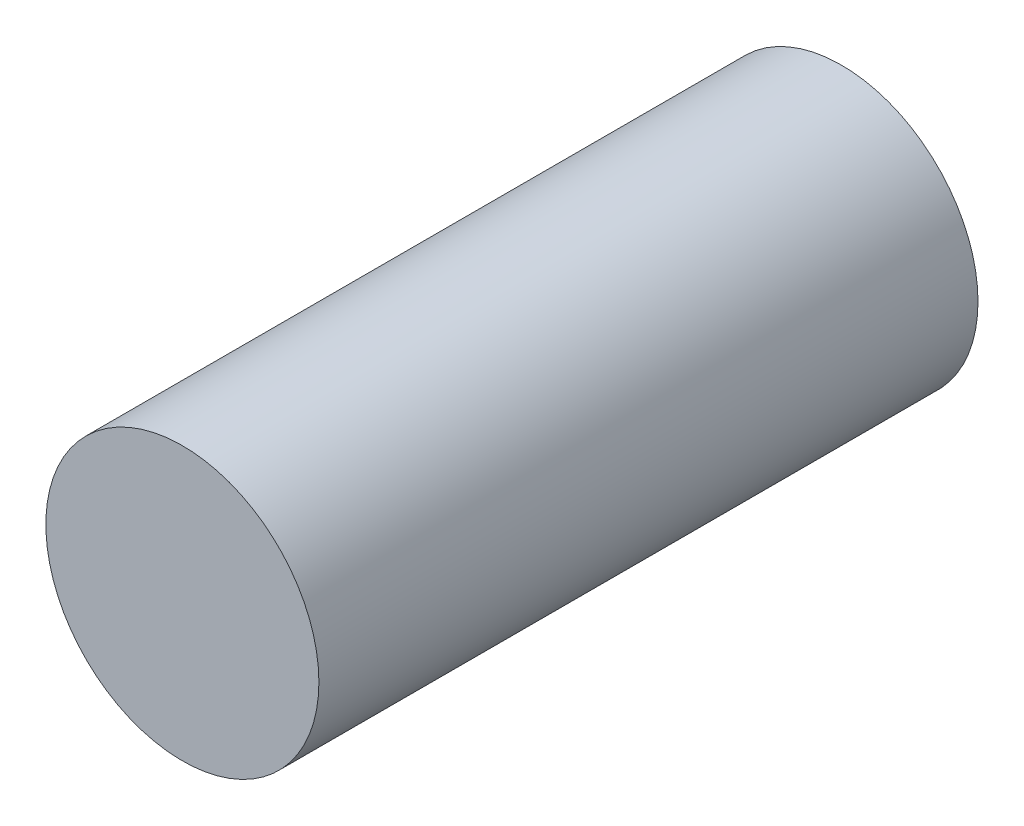
ISO-10303-21;
HEADER;
FILE_DESCRIPTION(('STEP AP214'),'2;1');
FILE_NAME('part.step','',(''),(''),'','','');
FILE_SCHEMA(('AUTOMOTIVE_DESIGN { 1 0 10303 214 1 1 1 1 }'));
ENDSEC;
DATA;
#1=APPLICATION_CONTEXT('core data for automotive mechanical design processes');
#2=APPLICATION_PROTOCOL_DEFINITION('international standard','automotive_design',2000,#1);
#3=PRODUCT_CONTEXT('',#1,'mechanical');
#4=PRODUCT('Part','Part','',(#3));
#5=PRODUCT_RELATED_PRODUCT_CATEGORY('part','',(#4));
#6=PRODUCT_DEFINITION_FORMATION('','',#4);
#7=PRODUCT_DEFINITION_CONTEXT('part definition',#1,'design');
#8=PRODUCT_DEFINITION('design','',#6,#7);
#9=PRODUCT_DEFINITION_SHAPE('','',#8);
#10=(LENGTH_UNIT() NAMED_UNIT(*) SI_UNIT(.MILLI.,.METRE.));
#11=(NAMED_UNIT(*) PLANE_ANGLE_UNIT() SI_UNIT($,.RADIAN.));
#12=(NAMED_UNIT(*) SI_UNIT($,.STERADIAN.) SOLID_ANGLE_UNIT());
#13=UNCERTAINTY_MEASURE_WITH_UNIT(LENGTH_MEASURE(1.E-05),#10,'distance_accuracy_value','');
#14=(GEOMETRIC_REPRESENTATION_CONTEXT(3) GLOBAL_UNCERTAINTY_ASSIGNED_CONTEXT((#13)) GLOBAL_UNIT_ASSIGNED_CONTEXT((#10,
#11,#12)) REPRESENTATION_CONTEXT('',''));
#15=CARTESIAN_POINT('',(0.,0.,0.));
#16=DIRECTION('',(0.,0.,1.));
#17=DIRECTION('',(1.,0.,0.));
#18=AXIS2_PLACEMENT_3D('',#15,#16,#17);
#19=CARTESIAN_POINT('',(0.,0.,7.));
#20=DIRECTION('',(0.,0.,-1.));
#21=DIRECTION('',(-1.,0.,0.));
#22=AXIS2_PLACEMENT_3D('',#19,#20,#21);
#23=CYLINDRICAL_SURFACE('',#22,1.45);
#24=CARTESIAN_POINT('',(0.,0.,7.));
#25=DIRECTION('',(0.,0.,1.));
#26=DIRECTION('',(1.,0.,0.));
#27=AXIS2_PLACEMENT_3D('',#24,#25,#26);
#28=CIRCLE('',#27,1.45);
#29=CARTESIAN_POINT('',(1.45,0.,7.));
#30=VERTEX_POINT('',#29);
#31=EDGE_CURVE('E10',#30,#30,#28,.T.);
#32=ORIENTED_EDGE('',*,*,#31,.F.);
#33=EDGE_LOOP('',(#32));
#34=FACE_BOUND('',#33,.T.);
#35=CARTESIAN_POINT('',(0.,0.,0.));
#36=DIRECTION('',(0.,0.,1.));
#37=DIRECTION('',(1.,0.,0.));
#38=AXIS2_PLACEMENT_3D('',#35,#36,#37);
#39=CIRCLE('',#38,1.45);
#40=CARTESIAN_POINT('',(1.45,0.,0.));
#41=VERTEX_POINT('',#40);
#42=EDGE_CURVE('E40',#41,#41,#39,.T.);
#43=ORIENTED_EDGE('',*,*,#42,.T.);
#44=EDGE_LOOP('',(#43));
#45=FACE_BOUND('',#44,.T.);
#46=ADVANCED_FACE('F37',(#34,#45),#23,.T.);
#47=CARTESIAN_POINT('',(0.,0.,7.));
#48=DIRECTION('',(0.,0.,1.));
#49=DIRECTION('',(1.,0.,0.));
#50=AXIS2_PLACEMENT_3D('',#47,#48,#49);
#51=PLANE('',#50);
#52=ORIENTED_EDGE('',*,*,#31,.T.);
#53=EDGE_LOOP('',(#52));
#54=FACE_BOUND('',#53,.T.);
#55=ADVANCED_FACE('F54',(#54),#51,.T.);
#56=CARTESIAN_POINT('',(0.,0.,0.));
#57=DIRECTION('',(0.,0.,1.));
#58=DIRECTION('',(1.,0.,0.));
#59=AXIS2_PLACEMENT_3D('',#56,#57,#58);
#60=PLANE('',#59);
#61=ORIENTED_EDGE('',*,*,#42,.F.);
#62=EDGE_LOOP('',(#61));
#63=FACE_BOUND('',#62,.T.);
#64=ADVANCED_FACE('F52',(#63),#60,.F.);
#65=CLOSED_SHELL('',(#46,#55,#64));
#66=MANIFOLD_SOLID_BREP('B2',#65);
#67=ADVANCED_BREP_SHAPE_REPRESENTATION('',(#18,#66),#14);
#68=SHAPE_DEFINITION_REPRESENTATION(#9,#67);
ENDSEC;
END-ISO-10303-21;
